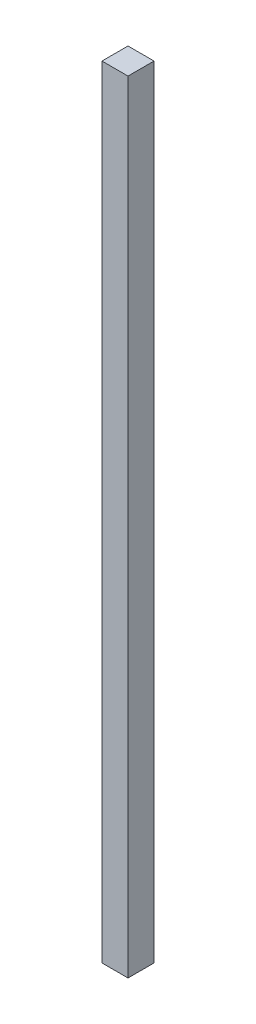
ISO-10303-21;
HEADER;
FILE_DESCRIPTION(('STEP AP214'),'2;1');
FILE_NAME('part.step','',(''),(''),'','','');
FILE_SCHEMA(('AUTOMOTIVE_DESIGN { 1 0 10303 214 1 1 1 1 }'));
ENDSEC;
DATA;
#1=APPLICATION_CONTEXT('core data for automotive mechanical design processes');
#2=APPLICATION_PROTOCOL_DEFINITION('international standard','automotive_design',2000,#1);
#3=PRODUCT_CONTEXT('',#1,'mechanical');
#4=PRODUCT('Part','Part','',(#3));
#5=PRODUCT_RELATED_PRODUCT_CATEGORY('part','',(#4));
#6=PRODUCT_DEFINITION_FORMATION('','',#4);
#7=PRODUCT_DEFINITION_CONTEXT('part definition',#1,'design');
#8=PRODUCT_DEFINITION('design','',#6,#7);
#9=PRODUCT_DEFINITION_SHAPE('','',#8);
#10=(LENGTH_UNIT() NAMED_UNIT(*) SI_UNIT(.MILLI.,.METRE.));
#11=(NAMED_UNIT(*) PLANE_ANGLE_UNIT() SI_UNIT($,.RADIAN.));
#12=(NAMED_UNIT(*) SI_UNIT($,.STERADIAN.) SOLID_ANGLE_UNIT());
#13=UNCERTAINTY_MEASURE_WITH_UNIT(LENGTH_MEASURE(1.E-05),#10,'distance_accuracy_value','');
#14=(GEOMETRIC_REPRESENTATION_CONTEXT(3) GLOBAL_UNCERTAINTY_ASSIGNED_CONTEXT((#13)) GLOBAL_UNIT_ASSIGNED_CONTEXT((#10,
#11,#12)) REPRESENTATION_CONTEXT('',''));
#15=CARTESIAN_POINT('',(0.,0.,0.));
#16=DIRECTION('',(0.,0.,1.));
#17=DIRECTION('',(1.,0.,0.));
#18=AXIS2_PLACEMENT_3D('',#15,#16,#17);
#19=CARTESIAN_POINT('',(0.,150.,0.));
#20=DIRECTION('',(1.,0.,0.));
#21=DIRECTION('',(0.,0.,-1.));
#22=AXIS2_PLACEMENT_3D('',#19,#20,#21);
#23=PLANE('',#22);
#24=DIRECTION('',(0.,0.,1.));
#25=VECTOR('',#24,1.);
#26=CARTESIAN_POINT('',(0.,0.,0.));
#27=LINE('',#26,#25);
#28=CARTESIAN_POINT('',(0.,0.,-5.));
#29=VERTEX_POINT('',#28);
#30=CARTESIAN_POINT('',(0.,0.,0.));
#31=VERTEX_POINT('',#30);
#32=EDGE_CURVE('E113',#29,#31,#27,.T.);
#33=ORIENTED_EDGE('',*,*,#32,.T.);
#34=DIRECTION('',(0.,-1.,0.));
#35=VECTOR('',#34,1.);
#36=CARTESIAN_POINT('',(0.,150.,0.));
#37=LINE('',#36,#35);
#38=CARTESIAN_POINT('',(0.,150.,0.));
#39=VERTEX_POINT('',#38);
#40=EDGE_CURVE('E11',#39,#31,#37,.T.);
#41=ORIENTED_EDGE('',*,*,#40,.F.);
#42=DIRECTION('',(0.,0.,1.));
#43=VECTOR('',#42,1.);
#44=CARTESIAN_POINT('',(0.,150.,0.));
#45=LINE('',#44,#43);
#46=CARTESIAN_POINT('',(0.,150.,-5.));
#47=VERTEX_POINT('',#46);
#48=EDGE_CURVE('E97',#47,#39,#45,.T.);
#49=ORIENTED_EDGE('',*,*,#48,.F.);
#50=DIRECTION('',(0.,-1.,0.));
#51=VECTOR('',#50,1.);
#52=CARTESIAN_POINT('',(0.,150.,-5.));
#53=LINE('',#52,#51);
#54=EDGE_CURVE('E109',#47,#29,#53,.T.);
#55=ORIENTED_EDGE('',*,*,#54,.T.);
#56=EDGE_LOOP('',(#33,#41,#49,#55));
#57=FACE_BOUND('',#56,.T.);
#58=ADVANCED_FACE('F45',(#57),#23,.F.);
#59=CARTESIAN_POINT('',(0.,150.,0.));
#60=DIRECTION('',(0.,0.,-1.));
#61=DIRECTION('',(-1.,0.,0.));
#62=AXIS2_PLACEMENT_3D('',#59,#60,#61);
#63=PLANE('',#62);
#64=DIRECTION('',(1.,0.,0.));
#65=VECTOR('',#64,1.);
#66=CARTESIAN_POINT('',(0.,0.,0.));
#67=LINE('',#66,#65);
#68=CARTESIAN_POINT('',(5.,0.,0.));
#69=VERTEX_POINT('',#68);
#70=EDGE_CURVE('E102',#31,#69,#67,.T.);
#71=ORIENTED_EDGE('',*,*,#70,.T.);
#72=DIRECTION('',(0.,-1.,0.));
#73=VECTOR('',#72,1.);
#74=CARTESIAN_POINT('',(5.,150.,0.));
#75=LINE('',#74,#73);
#76=CARTESIAN_POINT('',(5.,150.,0.));
#77=VERTEX_POINT('',#76);
#78=EDGE_CURVE('E54',#77,#69,#75,.T.);
#79=ORIENTED_EDGE('',*,*,#78,.F.);
#80=DIRECTION('',(1.,0.,0.));
#81=VECTOR('',#80,1.);
#82=CARTESIAN_POINT('',(0.,150.,0.));
#83=LINE('',#82,#81);
#84=EDGE_CURVE('E92',#39,#77,#83,.T.);
#85=ORIENTED_EDGE('',*,*,#84,.F.);
#86=ORIENTED_EDGE('',*,*,#40,.T.);
#87=EDGE_LOOP('',(#71,#79,#85,#86));
#88=FACE_BOUND('',#87,.T.);
#89=ADVANCED_FACE('F101',(#88),#63,.F.);
#90=CARTESIAN_POINT('',(5.,150.,0.));
#91=DIRECTION('',(-1.,0.,0.));
#92=DIRECTION('',(0.,0.,1.));
#93=AXIS2_PLACEMENT_3D('',#90,#91,#92);
#94=PLANE('',#93);
#95=DIRECTION('',(0.,0.,-1.));
#96=VECTOR('',#95,1.);
#97=CARTESIAN_POINT('',(5.,0.,0.));
#98=LINE('',#97,#96);
#99=CARTESIAN_POINT('',(5.,0.,-5.));
#100=VERTEX_POINT('',#99);
#101=EDGE_CURVE('E79',#69,#100,#98,.T.);
#102=ORIENTED_EDGE('',*,*,#101,.T.);
#103=DIRECTION('',(0.,-1.,0.));
#104=VECTOR('',#103,1.);
#105=CARTESIAN_POINT('',(5.,150.,-5.));
#106=LINE('',#105,#104);
#107=CARTESIAN_POINT('',(5.,150.,-5.));
#108=VERTEX_POINT('',#107);
#109=EDGE_CURVE('E104',#108,#100,#106,.T.);
#110=ORIENTED_EDGE('',*,*,#109,.F.);
#111=DIRECTION('',(0.,0.,-1.));
#112=VECTOR('',#111,1.);
#113=CARTESIAN_POINT('',(5.,150.,0.));
#114=LINE('',#113,#112);
#115=EDGE_CURVE('E95',#77,#108,#114,.T.);
#116=ORIENTED_EDGE('',*,*,#115,.F.);
#117=ORIENTED_EDGE('',*,*,#78,.T.);
#118=EDGE_LOOP('',(#102,#110,#116,#117));
#119=FACE_BOUND('',#118,.T.);
#120=ADVANCED_FACE('F105',(#119),#94,.F.);
#121=CARTESIAN_POINT('',(0.,150.,-5.));
#122=DIRECTION('',(0.,0.,1.));
#123=DIRECTION('',(1.,0.,0.));
#124=AXIS2_PLACEMENT_3D('',#121,#122,#123);
#125=PLANE('',#124);
#126=DIRECTION('',(-1.,0.,0.));
#127=VECTOR('',#126,1.);
#128=CARTESIAN_POINT('',(0.,0.,-5.));
#129=LINE('',#128,#127);
#130=EDGE_CURVE('E85',#100,#29,#129,.T.);
#131=ORIENTED_EDGE('',*,*,#130,.T.);
#132=ORIENTED_EDGE('',*,*,#54,.F.);
#133=DIRECTION('',(-1.,0.,0.));
#134=VECTOR('',#133,1.);
#135=CARTESIAN_POINT('',(0.,150.,-5.));
#136=LINE('',#135,#134);
#137=EDGE_CURVE('E62',#108,#47,#136,.T.);
#138=ORIENTED_EDGE('',*,*,#137,.F.);
#139=ORIENTED_EDGE('',*,*,#109,.T.);
#140=EDGE_LOOP('',(#131,#132,#138,#139));
#141=FACE_BOUND('',#140,.T.);
#142=ADVANCED_FACE('F126',(#141),#125,.F.);
#143=CARTESIAN_POINT('',(0.,150.,0.));
#144=DIRECTION('',(0.,-1.,0.));
#145=DIRECTION('',(0.,0.,-1.));
#146=AXIS2_PLACEMENT_3D('',#143,#144,#145);
#147=PLANE('',#146);
#148=ORIENTED_EDGE('',*,*,#48,.T.);
#149=ORIENTED_EDGE('',*,*,#84,.T.);
#150=ORIENTED_EDGE('',*,*,#115,.T.);
#151=ORIENTED_EDGE('',*,*,#137,.T.);
#152=EDGE_LOOP('',(#148,#149,#150,#151));
#153=FACE_BOUND('',#152,.T.);
#154=ADVANCED_FACE('F93',(#153),#147,.F.);
#155=CARTESIAN_POINT('',(0.,0.,0.));
#156=DIRECTION('',(0.,-1.,0.));
#157=DIRECTION('',(0.,0.,-1.));
#158=AXIS2_PLACEMENT_3D('',#155,#156,#157);
#159=PLANE('',#158);
#160=ORIENTED_EDGE('',*,*,#32,.F.);
#161=ORIENTED_EDGE('',*,*,#130,.F.);
#162=ORIENTED_EDGE('',*,*,#101,.F.);
#163=ORIENTED_EDGE('',*,*,#70,.F.);
#164=EDGE_LOOP('',(#160,#161,#162,#163));
#165=FACE_BOUND('',#164,.T.);
#166=ADVANCED_FACE('F129',(#165),#159,.T.);
#167=CLOSED_SHELL('',(#58,#89,#120,#142,#154,#166));
#168=MANIFOLD_SOLID_BREP('B2',#167);
#169=ADVANCED_BREP_SHAPE_REPRESENTATION('',(#18,#168),#14);
#170=SHAPE_DEFINITION_REPRESENTATION(#9,#169);
ENDSEC;
END-ISO-10303-21;
